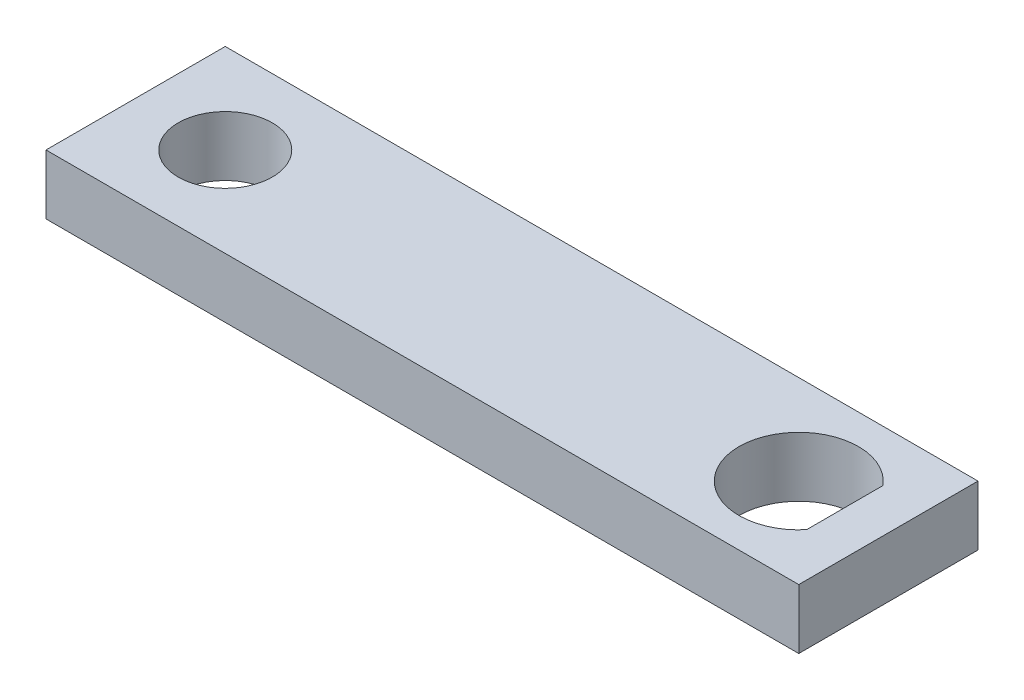
ISO-10303-21;
HEADER;
FILE_DESCRIPTION(('STEP AP214'),'2;1');
FILE_NAME('part.step','',(''),(''),'','','');
FILE_SCHEMA(('AUTOMOTIVE_DESIGN { 1 0 10303 214 1 1 1 1 }'));
ENDSEC;
DATA;
#1=APPLICATION_CONTEXT('core data for automotive mechanical design processes');
#2=APPLICATION_PROTOCOL_DEFINITION('international standard','automotive_design',2000,#1);
#3=PRODUCT_CONTEXT('',#1,'mechanical');
#4=PRODUCT('Part','Part','',(#3));
#5=PRODUCT_RELATED_PRODUCT_CATEGORY('part','',(#4));
#6=PRODUCT_DEFINITION_FORMATION('','',#4);
#7=PRODUCT_DEFINITION_CONTEXT('part definition',#1,'design');
#8=PRODUCT_DEFINITION('design','',#6,#7);
#9=PRODUCT_DEFINITION_SHAPE('','',#8);
#10=(LENGTH_UNIT() NAMED_UNIT(*) SI_UNIT(.MILLI.,.METRE.));
#11=(NAMED_UNIT(*) PLANE_ANGLE_UNIT() SI_UNIT($,.RADIAN.));
#12=(NAMED_UNIT(*) SI_UNIT($,.STERADIAN.) SOLID_ANGLE_UNIT());
#13=UNCERTAINTY_MEASURE_WITH_UNIT(LENGTH_MEASURE(1.E-05),#10,'distance_accuracy_value','');
#14=(GEOMETRIC_REPRESENTATION_CONTEXT(3) GLOBAL_UNCERTAINTY_ASSIGNED_CONTEXT((#13)) GLOBAL_UNIT_ASSIGNED_CONTEXT((#10,
#11,#12)) REPRESENTATION_CONTEXT('',''));
#15=CARTESIAN_POINT('',(0.,0.,0.));
#16=DIRECTION('',(0.,0.,1.));
#17=DIRECTION('',(1.,0.,0.));
#18=AXIS2_PLACEMENT_3D('',#15,#16,#17);
#19=CARTESIAN_POINT('',(0.,0.,19.05));
#20=DIRECTION('',(-1.,0.,0.));
#21=DIRECTION('',(0.,0.,1.));
#22=AXIS2_PLACEMENT_3D('',#19,#20,#21);
#23=PLANE('',#22);
#24=DIRECTION('',(0.,1.,0.));
#25=VECTOR('',#24,1.);
#26=CARTESIAN_POINT('',(0.,0.,0.));
#27=LINE('',#26,#25);
#28=CARTESIAN_POINT('',(0.,0.,0.));
#29=VERTEX_POINT('',#28);
#30=CARTESIAN_POINT('',(0.,6.35000000000001,0.));
#31=VERTEX_POINT('',#30);
#32=EDGE_CURVE('E111',#29,#31,#27,.T.);
#33=ORIENTED_EDGE('',*,*,#32,.F.);
#34=DIRECTION('',(0.,0.,-1.));
#35=VECTOR('',#34,1.);
#36=CARTESIAN_POINT('',(0.,0.,19.05));
#37=LINE('',#36,#35);
#38=CARTESIAN_POINT('',(0.,0.,19.05));
#39=VERTEX_POINT('',#38);
#40=EDGE_CURVE('E11',#39,#29,#37,.T.);
#41=ORIENTED_EDGE('',*,*,#40,.F.);
#42=DIRECTION('',(0.,1.,0.));
#43=VECTOR('',#42,1.);
#44=CARTESIAN_POINT('',(0.,0.,19.05));
#45=LINE('',#44,#43);
#46=CARTESIAN_POINT('',(0.,6.35000000000001,19.05));
#47=VERTEX_POINT('',#46);
#48=EDGE_CURVE('E113',#39,#47,#45,.T.);
#49=ORIENTED_EDGE('',*,*,#48,.T.);
#50=DIRECTION('',(0.,0.,-1.));
#51=VECTOR('',#50,1.);
#52=CARTESIAN_POINT('',(0.,6.35000000000001,19.05));
#53=LINE('',#52,#51);
#54=EDGE_CURVE('E41',#47,#31,#53,.T.);
#55=ORIENTED_EDGE('',*,*,#54,.T.);
#56=EDGE_LOOP('',(#33,#41,#49,#55));
#57=FACE_BOUND('',#56,.T.);
#58=ADVANCED_FACE('F38',(#57),#23,.T.);
#59=CARTESIAN_POINT('',(0.,0.,19.05));
#60=DIRECTION('',(0.,1.,0.));
#61=DIRECTION('',(0.,0.,1.));
#62=AXIS2_PLACEMENT_3D('',#59,#60,#61);
#63=PLANE('',#62);
#64=CARTESIAN_POINT('',(9.525,0.,9.525));
#65=DIRECTION('',(0.,1.,0.));
#66=DIRECTION('',(-1.,0.,0.));
#67=AXIS2_PLACEMENT_3D('',#64,#65,#66);
#68=CIRCLE('',#67,5.);
#69=CARTESIAN_POINT('',(4.525,0.,9.525));
#70=VERTEX_POINT('',#69);
#71=EDGE_CURVE('E109',#70,#70,#68,.T.);
#72=ORIENTED_EDGE('',*,*,#71,.T.);
#73=EDGE_LOOP('',(#72));
#74=FACE_BOUND('',#73,.T.);
#75=DIRECTION('',(0.,0.,1.));
#76=VECTOR('',#75,1.);
#77=CARTESIAN_POINT('',(75.3645,0.,5.47342132619889));
#78=LINE('',#77,#76);
#79=CARTESIAN_POINT('',(75.3645,0.,5.47342132619889));
#80=VERTEX_POINT('',#79);
#81=CARTESIAN_POINT('',(75.3645,0.,13.5765786738011));
#82=VERTEX_POINT('',#81);
#83=EDGE_CURVE('E90',#80,#82,#78,.T.);
#84=ORIENTED_EDGE('',*,*,#83,.F.);
#85=CARTESIAN_POINT('',(70.475,0.,9.525));
#86=DIRECTION('',(0.,1.,0.));
#87=DIRECTION('',(-1.,0.,0.));
#88=AXIS2_PLACEMENT_3D('',#85,#86,#87);
#89=CIRCLE('',#88,6.35);
#90=EDGE_CURVE('E54',#80,#82,#89,.T.);
#91=ORIENTED_EDGE('',*,*,#90,.T.);
#92=EDGE_LOOP('',(#84,#91));
#93=FACE_BOUND('',#92,.T.);
#94=DIRECTION('',(1.,0.,0.));
#95=VECTOR('',#94,1.);
#96=CARTESIAN_POINT('',(0.,0.,0.));
#97=LINE('',#96,#95);
#98=CARTESIAN_POINT('',(80.,0.,0.));
#99=VERTEX_POINT('',#98);
#100=EDGE_CURVE('E117',#29,#99,#97,.T.);
#101=ORIENTED_EDGE('',*,*,#100,.T.);
#102=DIRECTION('',(0.,0.,-1.));
#103=VECTOR('',#102,1.);
#104=CARTESIAN_POINT('',(80.,0.,19.05));
#105=LINE('',#104,#103);
#106=CARTESIAN_POINT('',(80.,0.,19.05));
#107=VERTEX_POINT('',#106);
#108=EDGE_CURVE('E46',#107,#99,#105,.T.);
#109=ORIENTED_EDGE('',*,*,#108,.F.);
#110=DIRECTION('',(1.,0.,0.));
#111=VECTOR('',#110,1.);
#112=CARTESIAN_POINT('',(0.,0.,19.05));
#113=LINE('',#112,#111);
#114=EDGE_CURVE('E122',#39,#107,#113,.T.);
#115=ORIENTED_EDGE('',*,*,#114,.F.);
#116=ORIENTED_EDGE('',*,*,#40,.T.);
#117=EDGE_LOOP('',(#101,#109,#115,#116));
#118=FACE_BOUND('',#117,.T.);
#119=ADVANCED_FACE('F100',(#74,#93,#118),#63,.F.);
#120=CARTESIAN_POINT('',(80.,6.34999999999999,19.05));
#121=DIRECTION('',(1.,0.,0.));
#122=DIRECTION('',(0.,0.,-1.));
#123=AXIS2_PLACEMENT_3D('',#120,#121,#122);
#124=PLANE('',#123);
#125=DIRECTION('',(0.,-1.,0.));
#126=VECTOR('',#125,1.);
#127=CARTESIAN_POINT('',(80.,6.34999999999999,0.));
#128=LINE('',#127,#126);
#129=CARTESIAN_POINT('',(80.,6.34999999999999,0.));
#130=VERTEX_POINT('',#129);
#131=EDGE_CURVE('E129',#130,#99,#128,.T.);
#132=ORIENTED_EDGE('',*,*,#131,.F.);
#133=DIRECTION('',(0.,0.,-1.));
#134=VECTOR('',#133,1.);
#135=CARTESIAN_POINT('',(80.,6.34999999999999,19.05));
#136=LINE('',#135,#134);
#137=CARTESIAN_POINT('',(80.,6.34999999999999,19.05));
#138=VERTEX_POINT('',#137);
#139=EDGE_CURVE('E135',#138,#130,#136,.T.);
#140=ORIENTED_EDGE('',*,*,#139,.F.);
#141=DIRECTION('',(0.,-1.,0.));
#142=VECTOR('',#141,1.);
#143=CARTESIAN_POINT('',(80.,6.34999999999999,19.05));
#144=LINE('',#143,#142);
#145=EDGE_CURVE('E119',#138,#107,#144,.T.);
#146=ORIENTED_EDGE('',*,*,#145,.T.);
#147=ORIENTED_EDGE('',*,*,#108,.T.);
#148=EDGE_LOOP('',(#132,#140,#146,#147));
#149=FACE_BOUND('',#148,.T.);
#150=ADVANCED_FACE('F154',(#149),#124,.T.);
#151=CARTESIAN_POINT('',(80.,6.34999999999999,19.05));
#152=DIRECTION('',(0.,-1.,0.));
#153=DIRECTION('',(1.,0.,0.));
#154=AXIS2_PLACEMENT_3D('',#151,#152,#153);
#155=PLANE('',#154);
#156=CARTESIAN_POINT('',(9.525,6.35000000000001,9.525));
#157=DIRECTION('',(0.,1.,0.));
#158=DIRECTION('',(-1.,0.,0.));
#159=AXIS2_PLACEMENT_3D('',#156,#157,#158);
#160=CIRCLE('',#159,5.);
#161=CARTESIAN_POINT('',(4.525,6.35000000000001,9.525));
#162=VERTEX_POINT('',#161);
#163=EDGE_CURVE('E106',#162,#162,#160,.T.);
#164=ORIENTED_EDGE('',*,*,#163,.F.);
#165=EDGE_LOOP('',(#164));
#166=FACE_BOUND('',#165,.T.);
#167=DIRECTION('',(0.,0.,1.));
#168=VECTOR('',#167,1.);
#169=CARTESIAN_POINT('',(75.3645,6.35,5.47342132619889));
#170=LINE('',#169,#168);
#171=CARTESIAN_POINT('',(75.3645,6.35,5.47342132619889));
#172=VERTEX_POINT('',#171);
#173=CARTESIAN_POINT('',(75.3645,6.35,13.5765786738011));
#174=VERTEX_POINT('',#173);
#175=EDGE_CURVE('E102',#172,#174,#170,.T.);
#176=ORIENTED_EDGE('',*,*,#175,.T.);
#177=CARTESIAN_POINT('',(70.475,6.35,9.525));
#178=DIRECTION('',(0.,1.,0.));
#179=DIRECTION('',(-1.,0.,0.));
#180=AXIS2_PLACEMENT_3D('',#177,#178,#179);
#181=CIRCLE('',#180,6.35);
#182=EDGE_CURVE('E59',#172,#174,#181,.T.);
#183=ORIENTED_EDGE('',*,*,#182,.F.);
#184=EDGE_LOOP('',(#176,#183));
#185=FACE_BOUND('',#184,.T.);
#186=DIRECTION('',(-1.,0.,0.));
#187=VECTOR('',#186,1.);
#188=CARTESIAN_POINT('',(80.,6.34999999999999,0.));
#189=LINE('',#188,#187);
#190=EDGE_CURVE('E126',#130,#31,#189,.T.);
#191=ORIENTED_EDGE('',*,*,#190,.T.);
#192=ORIENTED_EDGE('',*,*,#54,.F.);
#193=DIRECTION('',(-1.,0.,0.));
#194=VECTOR('',#193,1.);
#195=CARTESIAN_POINT('',(80.,6.34999999999999,19.05));
#196=LINE('',#195,#194);
#197=EDGE_CURVE('E116',#138,#47,#196,.T.);
#198=ORIENTED_EDGE('',*,*,#197,.F.);
#199=ORIENTED_EDGE('',*,*,#139,.T.);
#200=EDGE_LOOP('',(#191,#192,#198,#199));
#201=FACE_BOUND('',#200,.T.);
#202=ADVANCED_FACE('F143',(#166,#185,#201),#155,.F.);
#203=CARTESIAN_POINT('',(0.,0.,19.05));
#204=DIRECTION('',(0.,0.,-1.));
#205=DIRECTION('',(-1.,0.,0.));
#206=AXIS2_PLACEMENT_3D('',#203,#204,#205);
#207=PLANE('',#206);
#208=ORIENTED_EDGE('',*,*,#48,.F.);
#209=ORIENTED_EDGE('',*,*,#114,.T.);
#210=ORIENTED_EDGE('',*,*,#145,.F.);
#211=ORIENTED_EDGE('',*,*,#197,.T.);
#212=EDGE_LOOP('',(#208,#209,#210,#211));
#213=FACE_BOUND('',#212,.T.);
#214=ADVANCED_FACE('F152',(#213),#207,.F.);
#215=CARTESIAN_POINT('',(0.,0.,0.));
#216=DIRECTION('',(0.,0.,-1.));
#217=DIRECTION('',(-1.,0.,0.));
#218=AXIS2_PLACEMENT_3D('',#215,#216,#217);
#219=PLANE('',#218);
#220=ORIENTED_EDGE('',*,*,#32,.T.);
#221=ORIENTED_EDGE('',*,*,#190,.F.);
#222=ORIENTED_EDGE('',*,*,#131,.T.);
#223=ORIENTED_EDGE('',*,*,#100,.F.);
#224=EDGE_LOOP('',(#220,#221,#222,#223));
#225=FACE_BOUND('',#224,.T.);
#226=ADVANCED_FACE('F147',(#225),#219,.T.);
#227=CARTESIAN_POINT('',(70.475,0.,9.525));
#228=DIRECTION('',(0.,1.,0.));
#229=DIRECTION('',(-1.,0.,0.));
#230=AXIS2_PLACEMENT_3D('',#227,#228,#229);
#231=CYLINDRICAL_SURFACE('',#230,6.35);
#232=ORIENTED_EDGE('',*,*,#182,.T.);
#233=DIRECTION('',(0.,1.,0.));
#234=VECTOR('',#233,1.);
#235=CARTESIAN_POINT('',(75.3645,0.,13.5765786738011));
#236=LINE('',#235,#234);
#237=EDGE_CURVE('E93',#82,#174,#236,.T.);
#238=ORIENTED_EDGE('',*,*,#237,.F.);
#239=ORIENTED_EDGE('',*,*,#90,.F.);
#240=DIRECTION('',(0.,1.,0.));
#241=VECTOR('',#240,1.);
#242=CARTESIAN_POINT('',(75.3645,0.,5.47342132619889));
#243=LINE('',#242,#241);
#244=EDGE_CURVE('E95',#80,#172,#243,.T.);
#245=ORIENTED_EDGE('',*,*,#244,.T.);
#246=EDGE_LOOP('',(#232,#238,#239,#245));
#247=FACE_BOUND('',#246,.T.);
#248=ADVANCED_FACE('F98',(#247),#231,.F.);
#249=CARTESIAN_POINT('',(75.3645,0.,5.47342132619889));
#250=DIRECTION('',(-1.,0.,0.));
#251=DIRECTION('',(0.,-1.,0.));
#252=AXIS2_PLACEMENT_3D('',#249,#250,#251);
#253=PLANE('',#252);
#254=ORIENTED_EDGE('',*,*,#175,.F.);
#255=ORIENTED_EDGE('',*,*,#244,.F.);
#256=ORIENTED_EDGE('',*,*,#83,.T.);
#257=ORIENTED_EDGE('',*,*,#237,.T.);
#258=EDGE_LOOP('',(#254,#255,#256,#257));
#259=FACE_BOUND('',#258,.T.);
#260=ADVANCED_FACE('F92',(#259),#253,.T.);
#261=CARTESIAN_POINT('',(9.525,0.,9.525));
#262=DIRECTION('',(0.,1.,0.));
#263=DIRECTION('',(-1.,0.,0.));
#264=AXIS2_PLACEMENT_3D('',#261,#262,#263);
#265=CYLINDRICAL_SURFACE('',#264,5.);
#266=ORIENTED_EDGE('',*,*,#71,.F.);
#267=EDGE_LOOP('',(#266));
#268=FACE_BOUND('',#267,.T.);
#269=ORIENTED_EDGE('',*,*,#163,.T.);
#270=EDGE_LOOP('',(#269));
#271=FACE_BOUND('',#270,.T.);
#272=ADVANCED_FACE('F191',(#268,#271),#265,.F.);
#273=CLOSED_SHELL('',(#58,#119,#150,#202,#214,#226,#248,#260,#272));
#274=MANIFOLD_SOLID_BREP('B2',#273);
#275=ADVANCED_BREP_SHAPE_REPRESENTATION('',(#18,#274),#14);
#276=SHAPE_DEFINITION_REPRESENTATION(#9,#275);
ENDSEC;
END-ISO-10303-21;
